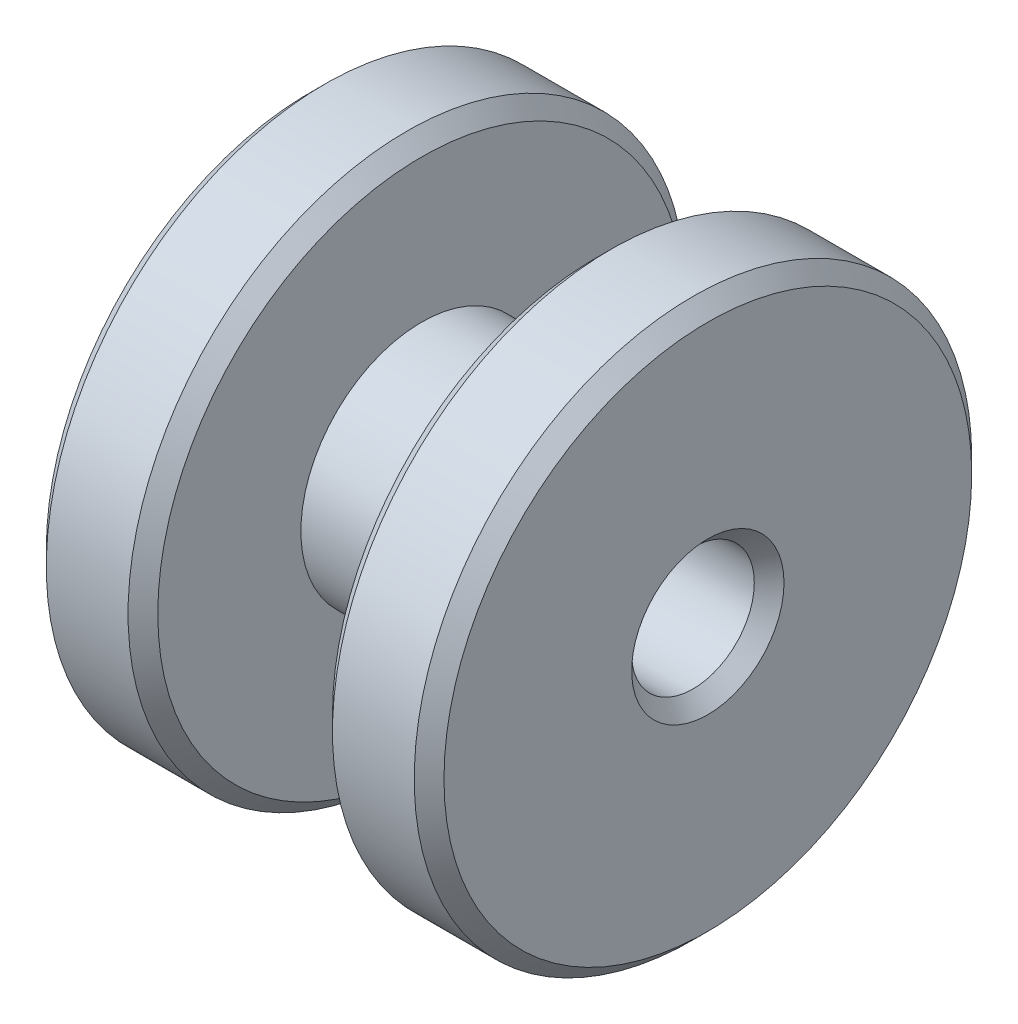
ISO-10303-21;
HEADER;
FILE_DESCRIPTION(('STEP AP214'),'2;1');
FILE_NAME('part.step','',(''),(''),'','','');
FILE_SCHEMA(('AUTOMOTIVE_DESIGN { 1 0 10303 214 1 1 1 1 }'));
ENDSEC;
DATA;
#1=APPLICATION_CONTEXT('core data for automotive mechanical design processes');
#2=APPLICATION_PROTOCOL_DEFINITION('international standard','automotive_design',2000,#1);
#3=PRODUCT_CONTEXT('',#1,'mechanical');
#4=PRODUCT('Part','Part','',(#3));
#5=PRODUCT_RELATED_PRODUCT_CATEGORY('part','',(#4));
#6=PRODUCT_DEFINITION_FORMATION('','',#4);
#7=PRODUCT_DEFINITION_CONTEXT('part definition',#1,'design');
#8=PRODUCT_DEFINITION('design','',#6,#7);
#9=PRODUCT_DEFINITION_SHAPE('','',#8);
#10=(LENGTH_UNIT() NAMED_UNIT(*) SI_UNIT(.MILLI.,.METRE.));
#11=(NAMED_UNIT(*) PLANE_ANGLE_UNIT() SI_UNIT($,.RADIAN.));
#12=(NAMED_UNIT(*) SI_UNIT($,.STERADIAN.) SOLID_ANGLE_UNIT());
#13=UNCERTAINTY_MEASURE_WITH_UNIT(LENGTH_MEASURE(1.E-05),#10,'distance_accuracy_value','');
#14=(GEOMETRIC_REPRESENTATION_CONTEXT(3) GLOBAL_UNCERTAINTY_ASSIGNED_CONTEXT((#13)) GLOBAL_UNIT_ASSIGNED_CONTEXT((#10,
#11,#12)) REPRESENTATION_CONTEXT('',''));
#15=CARTESIAN_POINT('',(0.,0.,0.));
#16=DIRECTION('',(0.,0.,1.));
#17=DIRECTION('',(1.,0.,0.));
#18=AXIS2_PLACEMENT_3D('',#15,#16,#17);
#19=CARTESIAN_POINT('',(-227.000000000003,68.999999999999,-294.081845262748));
#20=DIRECTION('',(1.,0.,0.));
#21=DIRECTION('',(0.,0.,1.));
#22=AXIS2_PLACEMENT_3D('',#19,#20,#21);
#23=CONICAL_SURFACE('',#22,4.1,0.785398163397448);
#24=CARTESIAN_POINT('',(-227.000000000003,68.999999999999,-294.081845262748));
#25=DIRECTION('',(-1.,0.,0.));
#26=DIRECTION('',(0.,0.,-1.));
#27=AXIS2_PLACEMENT_3D('',#24,#25,#26);
#28=CIRCLE('',#27,4.1);
#29=CARTESIAN_POINT('',(-227.000000000003,68.999999999999,-298.181845262748));
#30=VERTEX_POINT('',#29);
#31=EDGE_CURVE('E123',#30,#30,#28,.T.);
#32=ORIENTED_EDGE('',*,*,#31,.F.);
#33=EDGE_LOOP('',(#32));
#34=FACE_BOUND('',#33,.T.);
#35=CARTESIAN_POINT('',(-227.800000000003,68.999999999999,-294.081845262748));
#36=DIRECTION('',(1.,0.,0.));
#37=DIRECTION('',(0.,0.,-1.));
#38=AXIS2_PLACEMENT_3D('',#35,#36,#37);
#39=CIRCLE('',#38,3.3);
#40=CARTESIAN_POINT('',(-227.800000000003,68.999999999999,-297.381845262748));
#41=VERTEX_POINT('',#40);
#42=EDGE_CURVE('E284',#41,#41,#39,.T.);
#43=ORIENTED_EDGE('',*,*,#42,.F.);
#44=EDGE_LOOP('',(#43));
#45=FACE_BOUND('',#44,.T.);
#46=ADVANCED_FACE('F50',(#34,#45),#23,.F.);
#47=CARTESIAN_POINT('',(-247.600000000003,68.999999999999,-294.081845262748));
#48=DIRECTION('',(-1.,0.,0.));
#49=DIRECTION('',(0.,0.,-1.));
#50=AXIS2_PLACEMENT_3D('',#47,#48,#49);
#51=CONICAL_SURFACE('',#50,3.3,0.785398163397449);
#52=CARTESIAN_POINT('',(-247.600000000003,68.999999999999,-294.081845262748));
#53=DIRECTION('',(-1.,0.,0.));
#54=DIRECTION('',(0.,0.,-1.));
#55=AXIS2_PLACEMENT_3D('',#52,#53,#54);
#56=CIRCLE('',#55,3.3);
#57=CARTESIAN_POINT('',(-247.600000000003,68.999999999999,-297.381845262748));
#58=VERTEX_POINT('',#57);
#59=EDGE_CURVE('E282',#58,#58,#56,.T.);
#60=ORIENTED_EDGE('',*,*,#59,.F.);
#61=EDGE_LOOP('',(#60));
#62=FACE_BOUND('',#61,.T.);
#63=CARTESIAN_POINT('',(-248.400000000003,68.999999999999,-294.081845262748));
#64=DIRECTION('',(1.,0.,0.));
#65=DIRECTION('',(0.,0.,-1.));
#66=AXIS2_PLACEMENT_3D('',#63,#64,#65);
#67=CIRCLE('',#66,4.1);
#68=CARTESIAN_POINT('',(-248.400000000003,68.999999999999,-298.181845262748));
#69=VERTEX_POINT('',#68);
#70=EDGE_CURVE('E137',#69,#69,#67,.T.);
#71=ORIENTED_EDGE('',*,*,#70,.F.);
#72=EDGE_LOOP('',(#71));
#73=FACE_BOUND('',#72,.T.);
#74=ADVANCED_FACE('F218',(#62,#73),#51,.F.);
#75=CARTESIAN_POINT('',(-227.800000000003,68.999999999999,-294.081845262748));
#76=DIRECTION('',(-1.,0.,0.));
#77=DIRECTION('',(0.,0.,-1.));
#78=AXIS2_PLACEMENT_3D('',#75,#76,#77);
#79=CONICAL_SURFACE('',#78,15.,0.785398163397448);
#80=CARTESIAN_POINT('',(-227.800000000003,68.999999999999,-294.081845262748));
#81=DIRECTION('',(-1.,0.,0.));
#82=DIRECTION('',(0.,0.,-1.));
#83=AXIS2_PLACEMENT_3D('',#80,#81,#82);
#84=CIRCLE('',#83,15.);
#85=CARTESIAN_POINT('',(-227.800000000003,68.9999999999989,-309.081845262748));
#86=VERTEX_POINT('',#85);
#87=EDGE_CURVE('E281',#86,#86,#84,.T.);
#88=ORIENTED_EDGE('',*,*,#87,.F.);
#89=EDGE_LOOP('',(#88));
#90=FACE_BOUND('',#89,.T.);
#91=CARTESIAN_POINT('',(-227.000000000003,68.999999999999,-294.081845262748));
#92=DIRECTION('',(1.,0.,0.));
#93=DIRECTION('',(0.,0.,-1.));
#94=AXIS2_PLACEMENT_3D('',#91,#92,#93);
#95=CIRCLE('',#94,14.2);
#96=CARTESIAN_POINT('',(-227.000000000003,68.9999999999989,-308.281845262748));
#97=VERTEX_POINT('',#96);
#98=EDGE_CURVE('E113',#97,#97,#95,.T.);
#99=ORIENTED_EDGE('',*,*,#98,.F.);
#100=EDGE_LOOP('',(#99));
#101=FACE_BOUND('',#100,.T.);
#102=ADVANCED_FACE('F217',(#90,#101),#79,.T.);
#103=CARTESIAN_POINT('',(-233.000000000003,68.999999999999,-294.081845262748));
#104=DIRECTION('',(1.,0.,0.));
#105=DIRECTION('',(0.,0.,1.));
#106=AXIS2_PLACEMENT_3D('',#103,#104,#105);
#107=CONICAL_SURFACE('',#106,14.2,0.785398163397448);
#108=CARTESIAN_POINT('',(-233.000000000003,68.999999999999,-294.081845262748));
#109=DIRECTION('',(-1.,0.,0.));
#110=DIRECTION('',(0.,0.,-1.));
#111=AXIS2_PLACEMENT_3D('',#108,#109,#110);
#112=CIRCLE('',#111,14.2);
#113=CARTESIAN_POINT('',(-233.000000000003,68.9999999999989,-308.281845262748));
#114=VERTEX_POINT('',#113);
#115=EDGE_CURVE('E133',#114,#114,#112,.T.);
#116=ORIENTED_EDGE('',*,*,#115,.F.);
#117=EDGE_LOOP('',(#116));
#118=FACE_BOUND('',#117,.T.);
#119=CARTESIAN_POINT('',(-232.200000000003,68.999999999999,-294.081845262748));
#120=DIRECTION('',(1.,0.,0.));
#121=DIRECTION('',(0.,0.,-1.));
#122=AXIS2_PLACEMENT_3D('',#119,#120,#121);
#123=CIRCLE('',#122,15.);
#124=CARTESIAN_POINT('',(-232.200000000003,68.9999999999989,-309.081845262748));
#125=VERTEX_POINT('',#124);
#126=EDGE_CURVE('E288',#125,#125,#123,.T.);
#127=ORIENTED_EDGE('',*,*,#126,.F.);
#128=EDGE_LOOP('',(#127));
#129=FACE_BOUND('',#128,.T.);
#130=ADVANCED_FACE('F239',(#118,#129),#107,.T.);
#131=CARTESIAN_POINT('',(-243.200000000003,68.999999999999,-294.081845262748));
#132=DIRECTION('',(-1.,0.,0.));
#133=DIRECTION('',(0.,0.,-1.));
#134=AXIS2_PLACEMENT_3D('',#131,#132,#133);
#135=CONICAL_SURFACE('',#134,15.,0.785398163397449);
#136=CARTESIAN_POINT('',(-243.200000000003,68.999999999999,-294.081845262748));
#137=DIRECTION('',(-1.,0.,0.));
#138=DIRECTION('',(0.,0.,-1.));
#139=AXIS2_PLACEMENT_3D('',#136,#137,#138);
#140=CIRCLE('',#139,15.);
#141=CARTESIAN_POINT('',(-243.200000000003,68.999999999999,-309.081845262748));
#142=VERTEX_POINT('',#141);
#143=EDGE_CURVE('E81',#142,#142,#140,.T.);
#144=ORIENTED_EDGE('',*,*,#143,.F.);
#145=EDGE_LOOP('',(#144));
#146=FACE_BOUND('',#145,.T.);
#147=CARTESIAN_POINT('',(-242.400000000003,68.999999999999,-294.081845262748));
#148=DIRECTION('',(1.,0.,0.));
#149=DIRECTION('',(0.,0.,-1.));
#150=AXIS2_PLACEMENT_3D('',#147,#148,#149);
#151=CIRCLE('',#150,14.2);
#152=CARTESIAN_POINT('',(-242.400000000003,68.999999999999,-308.281845262748));
#153=VERTEX_POINT('',#152);
#154=EDGE_CURVE('E11',#153,#153,#151,.T.);
#155=ORIENTED_EDGE('',*,*,#154,.F.);
#156=EDGE_LOOP('',(#155));
#157=FACE_BOUND('',#156,.T.);
#158=ADVANCED_FACE('F227',(#146,#157),#135,.T.);
#159=CARTESIAN_POINT('',(-248.400000000003,68.999999999999,-294.081845262748));
#160=DIRECTION('',(1.,0.,0.));
#161=DIRECTION('',(0.,0.,1.));
#162=AXIS2_PLACEMENT_3D('',#159,#160,#161);
#163=CONICAL_SURFACE('',#162,14.2,0.785398163397449);
#164=CARTESIAN_POINT('',(-248.400000000003,68.999999999999,-294.081845262748));
#165=DIRECTION('',(-1.,0.,0.));
#166=DIRECTION('',(0.,0.,-1.));
#167=AXIS2_PLACEMENT_3D('',#164,#165,#166);
#168=CIRCLE('',#167,14.2);
#169=CARTESIAN_POINT('',(-248.400000000003,68.999999999999,-308.281845262748));
#170=VERTEX_POINT('',#169);
#171=EDGE_CURVE('E54',#170,#170,#168,.T.);
#172=ORIENTED_EDGE('',*,*,#171,.F.);
#173=EDGE_LOOP('',(#172));
#174=FACE_BOUND('',#173,.T.);
#175=CARTESIAN_POINT('',(-247.600000000003,68.999999999999,-294.081845262748));
#176=DIRECTION('',(1.,0.,0.));
#177=DIRECTION('',(0.,0.,-1.));
#178=AXIS2_PLACEMENT_3D('',#175,#176,#177);
#179=CIRCLE('',#178,15.);
#180=CARTESIAN_POINT('',(-247.600000000003,68.999999999999,-309.081845262748));
#181=VERTEX_POINT('',#180);
#182=EDGE_CURVE('E95',#181,#181,#179,.T.);
#183=ORIENTED_EDGE('',*,*,#182,.F.);
#184=EDGE_LOOP('',(#183));
#185=FACE_BOUND('',#184,.T.);
#186=ADVANCED_FACE('F208',(#174,#185),#163,.T.);
#187=CARTESIAN_POINT('',(-242.400000000003,68.999999999999,-294.081845262748));
#188=DIRECTION('',(-1.,0.,0.));
#189=DIRECTION('',(0.,-1.,0.));
#190=AXIS2_PLACEMENT_3D('',#187,#188,#189);
#191=PLANE('',#190);
#192=CARTESIAN_POINT('',(-242.400000000003,68.999999999999,-294.081845262748));
#193=DIRECTION('',(-1.,0.,0.));
#194=DIRECTION('',(0.,0.,-1.));
#195=AXIS2_PLACEMENT_3D('',#192,#193,#194);
#196=CIRCLE('',#195,6.5);
#197=CARTESIAN_POINT('',(-242.400000000003,68.999999999999,-300.581845262748));
#198=VERTEX_POINT('',#197);
#199=EDGE_CURVE('E118',#198,#198,#196,.T.);
#200=ORIENTED_EDGE('',*,*,#199,.T.);
#201=EDGE_LOOP('',(#200));
#202=FACE_BOUND('',#201,.T.);
#203=ORIENTED_EDGE('',*,*,#154,.T.);
#204=EDGE_LOOP('',(#203));
#205=FACE_BOUND('',#204,.T.);
#206=ADVANCED_FACE('F205',(#202,#205),#191,.F.);
#207=CARTESIAN_POINT('',(-248.400000000003,68.999999999999,-294.081845262748));
#208=DIRECTION('',(-1.,0.,0.));
#209=DIRECTION('',(0.,-1.,0.));
#210=AXIS2_PLACEMENT_3D('',#207,#208,#209);
#211=PLANE('',#210);
#212=ORIENTED_EDGE('',*,*,#171,.T.);
#213=EDGE_LOOP('',(#212));
#214=FACE_BOUND('',#213,.T.);
#215=ORIENTED_EDGE('',*,*,#70,.T.);
#216=EDGE_LOOP('',(#215));
#217=FACE_BOUND('',#216,.T.);
#218=ADVANCED_FACE('F191',(#214,#217),#211,.T.);
#219=CARTESIAN_POINT('',(-248.400000000003,68.999999999999,-294.081845262748));
#220=DIRECTION('',(1.,0.,0.));
#221=DIRECTION('',(0.,0.,1.));
#222=AXIS2_PLACEMENT_3D('',#219,#220,#221);
#223=CYLINDRICAL_SURFACE('',#222,15.);
#224=ORIENTED_EDGE('',*,*,#143,.T.);
#225=EDGE_LOOP('',(#224));
#226=FACE_BOUND('',#225,.T.);
#227=ORIENTED_EDGE('',*,*,#182,.T.);
#228=EDGE_LOOP('',(#227));
#229=FACE_BOUND('',#228,.T.);
#230=ADVANCED_FACE('F178',(#226,#229),#223,.T.);
#231=CARTESIAN_POINT('',(-242.400000000003,68.999999999999,-294.081845262748));
#232=DIRECTION('',(1.,0.,0.));
#233=DIRECTION('',(0.,0.,1.));
#234=AXIS2_PLACEMENT_3D('',#231,#232,#233);
#235=CYLINDRICAL_SURFACE('',#234,6.5);
#236=CARTESIAN_POINT('',(-233.000000000003,68.999999999999,-294.081845262748));
#237=DIRECTION('',(-1.,0.,0.));
#238=DIRECTION('',(0.,0.,-1.));
#239=AXIS2_PLACEMENT_3D('',#236,#237,#238);
#240=CIRCLE('',#239,6.5);
#241=CARTESIAN_POINT('',(-233.000000000003,68.999999999999,-300.581845262748));
#242=VERTEX_POINT('',#241);
#243=EDGE_CURVE('E129',#242,#242,#240,.T.);
#244=ORIENTED_EDGE('',*,*,#243,.T.);
#245=EDGE_LOOP('',(#244));
#246=FACE_BOUND('',#245,.T.);
#247=ORIENTED_EDGE('',*,*,#199,.F.);
#248=EDGE_LOOP('',(#247));
#249=FACE_BOUND('',#248,.T.);
#250=ADVANCED_FACE('F174',(#246,#249),#235,.T.);
#251=CARTESIAN_POINT('',(-227.000000000003,68.999999999999,-294.081845262748));
#252=DIRECTION('',(-1.,0.,0.));
#253=DIRECTION('',(0.,-1.,0.));
#254=AXIS2_PLACEMENT_3D('',#251,#252,#253);
#255=PLANE('',#254);
#256=ORIENTED_EDGE('',*,*,#98,.T.);
#257=EDGE_LOOP('',(#256));
#258=FACE_BOUND('',#257,.T.);
#259=ORIENTED_EDGE('',*,*,#31,.T.);
#260=EDGE_LOOP('',(#259));
#261=FACE_BOUND('',#260,.T.);
#262=ADVANCED_FACE('F117',(#258,#261),#255,.F.);
#263=CARTESIAN_POINT('',(-233.000000000003,68.999999999999,-294.081845262748));
#264=DIRECTION('',(-1.,0.,0.));
#265=DIRECTION('',(0.,-1.,0.));
#266=AXIS2_PLACEMENT_3D('',#263,#264,#265);
#267=PLANE('',#266);
#268=ORIENTED_EDGE('',*,*,#243,.F.);
#269=EDGE_LOOP('',(#268));
#270=FACE_BOUND('',#269,.T.);
#271=ORIENTED_EDGE('',*,*,#115,.T.);
#272=EDGE_LOOP('',(#271));
#273=FACE_BOUND('',#272,.T.);
#274=ADVANCED_FACE('F158',(#270,#273),#267,.T.);
#275=CARTESIAN_POINT('',(-233.000000000003,68.999999999999,-294.081845262748));
#276=DIRECTION('',(1.,0.,0.));
#277=DIRECTION('',(0.,0.,1.));
#278=AXIS2_PLACEMENT_3D('',#275,#276,#277);
#279=CYLINDRICAL_SURFACE('',#278,3.3);
#280=ORIENTED_EDGE('',*,*,#42,.T.);
#281=EDGE_LOOP('',(#280));
#282=FACE_BOUND('',#281,.T.);
#283=ORIENTED_EDGE('',*,*,#59,.T.);
#284=EDGE_LOOP('',(#283));
#285=FACE_BOUND('',#284,.T.);
#286=ADVANCED_FACE('F152',(#282,#285),#279,.F.);
#287=CARTESIAN_POINT('',(-233.000000000003,68.999999999999,-294.081845262748));
#288=DIRECTION('',(1.,0.,0.));
#289=DIRECTION('',(0.,0.,1.));
#290=AXIS2_PLACEMENT_3D('',#287,#288,#289);
#291=CYLINDRICAL_SURFACE('',#290,15.);
#292=ORIENTED_EDGE('',*,*,#87,.T.);
#293=EDGE_LOOP('',(#292));
#294=FACE_BOUND('',#293,.T.);
#295=ORIENTED_EDGE('',*,*,#126,.T.);
#296=EDGE_LOOP('',(#295));
#297=FACE_BOUND('',#296,.T.);
#298=ADVANCED_FACE('F147',(#294,#297),#291,.T.);
#299=CLOSED_SHELL('',(#46,#74,#102,#130,#158,#186,#206,#218,#230,#250,#262,#274,#286,#298));
#300=MANIFOLD_SOLID_BREP('B2',#299);
#301=ADVANCED_BREP_SHAPE_REPRESENTATION('',(#18,#300),#14);
#302=SHAPE_DEFINITION_REPRESENTATION(#9,#301);
ENDSEC;
END-ISO-10303-21;
